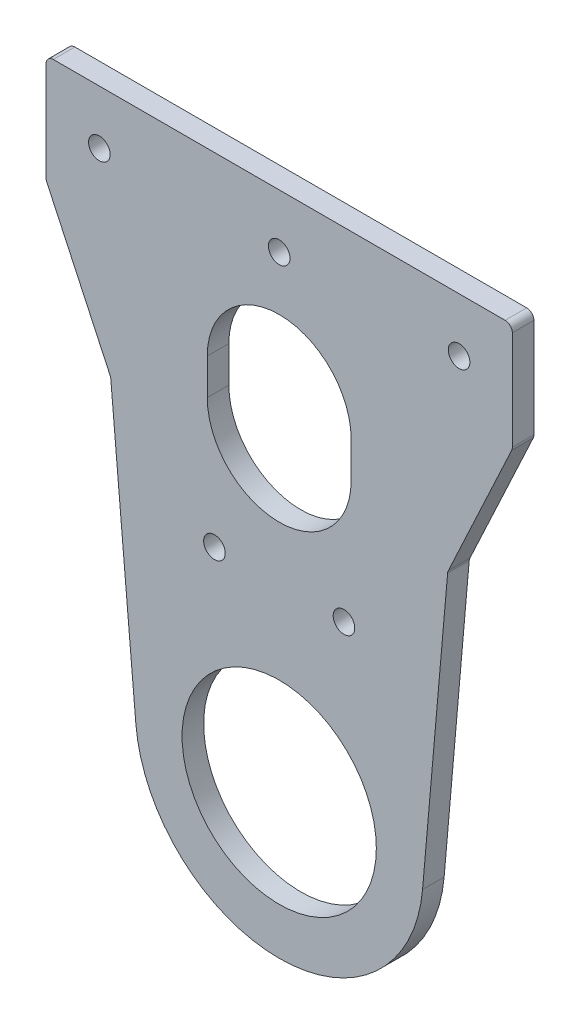
ISO-10303-21;
HEADER;
FILE_DESCRIPTION(('STEP AP214'),'2;1');
FILE_NAME('part.step','',(''),(''),'','','');
FILE_SCHEMA(('AUTOMOTIVE_DESIGN { 1 0 10303 214 1 1 1 1 }'));
ENDSEC;
DATA;
#1=APPLICATION_CONTEXT('core data for automotive mechanical design processes');
#2=APPLICATION_PROTOCOL_DEFINITION('international standard','automotive_design',2000,#1);
#3=PRODUCT_CONTEXT('',#1,'mechanical');
#4=PRODUCT('Part','Part','',(#3));
#5=PRODUCT_RELATED_PRODUCT_CATEGORY('part','',(#4));
#6=PRODUCT_DEFINITION_FORMATION('','',#4);
#7=PRODUCT_DEFINITION_CONTEXT('part definition',#1,'design');
#8=PRODUCT_DEFINITION('design','',#6,#7);
#9=PRODUCT_DEFINITION_SHAPE('','',#8);
#10=(LENGTH_UNIT() NAMED_UNIT(*) SI_UNIT(.MILLI.,.METRE.));
#11=(NAMED_UNIT(*) PLANE_ANGLE_UNIT() SI_UNIT($,.RADIAN.));
#12=(NAMED_UNIT(*) SI_UNIT($,.STERADIAN.) SOLID_ANGLE_UNIT());
#13=UNCERTAINTY_MEASURE_WITH_UNIT(LENGTH_MEASURE(1.E-05),#10,'distance_accuracy_value','');
#14=(GEOMETRIC_REPRESENTATION_CONTEXT(3) GLOBAL_UNCERTAINTY_ASSIGNED_CONTEXT((#13)) GLOBAL_UNIT_ASSIGNED_CONTEXT((#10,
#11,#12)) REPRESENTATION_CONTEXT('',''));
#15=CARTESIAN_POINT('',(0.,0.,0.));
#16=DIRECTION('',(0.,0.,1.));
#17=DIRECTION('',(1.,0.,0.));
#18=AXIS2_PLACEMENT_3D('',#15,#16,#17);
#19=CARTESIAN_POINT('',(0.,0.,3.));
#20=DIRECTION('',(0.,0.,1.));
#21=DIRECTION('',(1.,0.,0.));
#22=AXIS2_PLACEMENT_3D('',#19,#20,#21);
#23=PLANE('',#22);
#24=CARTESIAN_POINT('',(-9.,25.,3.));
#25=DIRECTION('',(0.,0.,1.));
#26=DIRECTION('',(1.,0.,0.));
#27=AXIS2_PLACEMENT_3D('',#24,#25,#26);
#28=CIRCLE('',#27,1.5);
#29=CARTESIAN_POINT('',(-7.5,25.,3.));
#30=VERTEX_POINT('',#29);
#31=EDGE_CURVE('E197',#30,#30,#28,.T.);
#32=ORIENTED_EDGE('',*,*,#31,.F.);
#33=EDGE_LOOP('',(#32));
#34=FACE_BOUND('',#33,.T.);
#35=CARTESIAN_POINT('',(-25.,65.,3.));
#36=DIRECTION('',(0.,0.,1.));
#37=DIRECTION('',(1.,0.,0.));
#38=AXIS2_PLACEMENT_3D('',#35,#36,#37);
#39=CIRCLE('',#38,1.5);
#40=CARTESIAN_POINT('',(-23.5,65.,3.));
#41=VERTEX_POINT('',#40);
#42=EDGE_CURVE('E214',#41,#41,#39,.T.);
#43=ORIENTED_EDGE('',*,*,#42,.F.);
#44=EDGE_LOOP('',(#43));
#45=FACE_BOUND('',#44,.T.);
#46=CARTESIAN_POINT('',(0.,0.,3.));
#47=DIRECTION('',(0.,0.,1.));
#48=DIRECTION('',(1.,0.,0.));
#49=AXIS2_PLACEMENT_3D('',#46,#47,#48);
#50=CIRCLE('',#49,13.5);
#51=CARTESIAN_POINT('',(13.5,0.,3.));
#52=VERTEX_POINT('',#51);
#53=EDGE_CURVE('E226',#52,#52,#50,.T.);
#54=ORIENTED_EDGE('',*,*,#53,.F.);
#55=EDGE_LOOP('',(#54));
#56=FACE_BOUND('',#55,.T.);
#57=DIRECTION('',(0.,-1.,0.));
#58=VECTOR('',#57,1.);
#59=CARTESIAN_POINT('',(-32.4,72.5,3.));
#60=LINE('',#59,#58);
#61=CARTESIAN_POINT('',(-32.4,71.5,3.));
#62=VERTEX_POINT('',#61);
#63=CARTESIAN_POINT('',(-32.4,57.7216946626429,3.));
#64=VERTEX_POINT('',#63);
#65=EDGE_CURVE('E242',#62,#64,#60,.T.);
#66=ORIENTED_EDGE('',*,*,#65,.T.);
#67=CARTESIAN_POINT('',(-31.4,57.7216946626429,3.));
#68=DIRECTION('',(0.,0.,1.));
#69=DIRECTION('',(1.,0.,0.));
#70=AXIS2_PLACEMENT_3D('',#67,#68,#69);
#71=CIRCLE('',#70,1.);
#72=CARTESIAN_POINT('',(-32.3063077870366,57.2990764009022,3.));
#73=VERTEX_POINT('',#72);
#74=EDGE_CURVE('E302',#64,#73,#71,.T.);
#75=ORIENTED_EDGE('',*,*,#74,.T.);
#76=DIRECTION('',(0.4226182617407,-0.90630778703665,0.));
#77=VECTOR('',#76,1.);
#78=CARTESIAN_POINT('',(-32.4,57.5,3.));
#79=LINE('',#78,#77);
#80=CARTESIAN_POINT('',(-23.4971863560778,38.407854528602,3.));
#81=VERTEX_POINT('',#80);
#82=EDGE_CURVE('E245',#73,#81,#79,.T.);
#83=ORIENTED_EDGE('',*,*,#82,.T.);
#84=CARTESIAN_POINT('',(-24.4034941431145,37.9852362668613,3.));
#85=DIRECTION('',(0.,0.,1.));
#86=DIRECTION('',(1.,0.,0.));
#87=AXIS2_PLACEMENT_3D('',#84,#85,#86);
#88=CIRCLE('',#87,1.);
#89=CARTESIAN_POINT('',(-23.4072994450227,38.072392009609,3.));
#90=VERTEX_POINT('',#89);
#91=EDGE_CURVE('E11',#81,#90,#88,.F.);
#92=ORIENTED_EDGE('',*,*,#91,.T.);
#93=DIRECTION('',(0.0871557427476584,-0.996194698091745,0.));
#94=VECTOR('',#93,1.);
#95=CARTESIAN_POINT('',(-23.4226673539928,38.2480480129213,3.));
#96=LINE('',#95,#94);
#97=CARTESIAN_POINT('',(-19.9238939618349,-1.74311485495317,3.));
#98=VERTEX_POINT('',#97);
#99=EDGE_CURVE('E247',#90,#98,#96,.T.);
#100=ORIENTED_EDGE('',*,*,#99,.T.);
#101=CARTESIAN_POINT('',(0.,0.,3.));
#102=DIRECTION('',(0.,0.,1.));
#103=DIRECTION('',(1.,0.,0.));
#104=AXIS2_PLACEMENT_3D('',#101,#102,#103);
#105=CIRCLE('',#104,20.);
#106=CARTESIAN_POINT('',(19.9238939618349,-1.74311485495318,3.));
#107=VERTEX_POINT('',#106);
#108=EDGE_CURVE('E249',#98,#107,#105,.T.);
#109=ORIENTED_EDGE('',*,*,#108,.T.);
#110=DIRECTION('',(0.0871557427476584,0.996194698091745,0.));
#111=VECTOR('',#110,1.);
#112=CARTESIAN_POINT('',(23.4226673539928,38.2480480129213,3.));
#113=LINE('',#112,#111);
#114=CARTESIAN_POINT('',(23.4072994450227,38.072392009609,3.));
#115=VERTEX_POINT('',#114);
#116=EDGE_CURVE('E251',#107,#115,#113,.T.);
#117=ORIENTED_EDGE('',*,*,#116,.T.);
#118=CARTESIAN_POINT('',(24.4034941431145,37.9852362668613,3.));
#119=DIRECTION('',(0.,0.,1.));
#120=DIRECTION('',(1.,0.,0.));
#121=AXIS2_PLACEMENT_3D('',#118,#119,#120);
#122=CIRCLE('',#121,1.);
#123=CARTESIAN_POINT('',(23.4971863560778,38.407854528602,3.));
#124=VERTEX_POINT('',#123);
#125=EDGE_CURVE('E325',#115,#124,#122,.F.);
#126=ORIENTED_EDGE('',*,*,#125,.T.);
#127=DIRECTION('',(0.4226182617407,0.90630778703665,0.));
#128=VECTOR('',#127,1.);
#129=CARTESIAN_POINT('',(32.4,57.5,3.));
#130=LINE('',#129,#128);
#131=CARTESIAN_POINT('',(32.3063077870366,57.2990764009022,3.));
#132=VERTEX_POINT('',#131);
#133=EDGE_CURVE('E232',#124,#132,#130,.T.);
#134=ORIENTED_EDGE('',*,*,#133,.T.);
#135=CARTESIAN_POINT('',(31.4,57.7216946626429,3.));
#136=DIRECTION('',(0.,0.,1.));
#137=DIRECTION('',(1.,0.,0.));
#138=AXIS2_PLACEMENT_3D('',#135,#136,#137);
#139=CIRCLE('',#138,1.);
#140=CARTESIAN_POINT('',(32.4,57.7216946626429,3.));
#141=VERTEX_POINT('',#140);
#142=EDGE_CURVE('E300',#132,#141,#139,.T.);
#143=ORIENTED_EDGE('',*,*,#142,.T.);
#144=DIRECTION('',(0.,1.,0.));
#145=VECTOR('',#144,1.);
#146=CARTESIAN_POINT('',(32.4,72.5,3.));
#147=LINE('',#146,#145);
#148=CARTESIAN_POINT('',(32.4,71.5,3.));
#149=VERTEX_POINT('',#148);
#150=EDGE_CURVE('E235',#141,#149,#147,.T.);
#151=ORIENTED_EDGE('',*,*,#150,.T.);
#152=CARTESIAN_POINT('',(31.4,71.5,3.));
#153=DIRECTION('',(0.,0.,1.));
#154=DIRECTION('',(1.,0.,0.));
#155=AXIS2_PLACEMENT_3D('',#152,#153,#154);
#156=CIRCLE('',#155,1.);
#157=CARTESIAN_POINT('',(31.4,72.5,3.));
#158=VERTEX_POINT('',#157);
#159=EDGE_CURVE('E298',#149,#158,#156,.T.);
#160=ORIENTED_EDGE('',*,*,#159,.T.);
#161=DIRECTION('',(-1.,0.,0.));
#162=VECTOR('',#161,1.);
#163=CARTESIAN_POINT('',(-32.4,72.5,3.));
#164=LINE('',#163,#162);
#165=CARTESIAN_POINT('',(-31.4,72.5,3.));
#166=VERTEX_POINT('',#165);
#167=EDGE_CURVE('E239',#158,#166,#164,.T.);
#168=ORIENTED_EDGE('',*,*,#167,.T.);
#169=CARTESIAN_POINT('',(-31.4,71.5,3.));
#170=DIRECTION('',(0.,0.,1.));
#171=DIRECTION('',(1.,0.,0.));
#172=AXIS2_PLACEMENT_3D('',#169,#170,#171);
#173=CIRCLE('',#172,1.);
#174=EDGE_CURVE('E296',#166,#62,#173,.T.);
#175=ORIENTED_EDGE('',*,*,#174,.T.);
#176=EDGE_LOOP('',(#66,#75,#83,#92,#100,#109,#117,#126,#134,#143,#151,#160,#168,#175));
#177=FACE_BOUND('',#176,.T.);
#178=CARTESIAN_POINT('',(25.,65.,3.));
#179=DIRECTION('',(0.,0.,1.));
#180=DIRECTION('',(1.,0.,0.));
#181=AXIS2_PLACEMENT_3D('',#178,#179,#180);
#182=CIRCLE('',#181,1.5);
#183=CARTESIAN_POINT('',(26.5,65.,3.));
#184=VERTEX_POINT('',#183);
#185=EDGE_CURVE('E220',#184,#184,#182,.T.);
#186=ORIENTED_EDGE('',*,*,#185,.F.);
#187=EDGE_LOOP('',(#186));
#188=FACE_BOUND('',#187,.T.);
#189=CARTESIAN_POINT('',(0.,65.,3.));
#190=DIRECTION('',(0.,0.,1.));
#191=DIRECTION('',(1.,0.,0.));
#192=AXIS2_PLACEMENT_3D('',#189,#190,#191);
#193=CIRCLE('',#192,1.5);
#194=CARTESIAN_POINT('',(1.5,65.,3.));
#195=VERTEX_POINT('',#194);
#196=EDGE_CURVE('E208',#195,#195,#193,.T.);
#197=ORIENTED_EDGE('',*,*,#196,.F.);
#198=EDGE_LOOP('',(#197));
#199=FACE_BOUND('',#198,.T.);
#200=DIRECTION('',(0.,-1.,0.));
#201=VECTOR('',#200,1.);
#202=CARTESIAN_POINT('',(-10.,47.5,3.));
#203=LINE('',#202,#201);
#204=CARTESIAN_POINT('',(-10.,47.5,3.));
#205=VERTEX_POINT('',#204);
#206=CARTESIAN_POINT('',(-10.,42.5,3.));
#207=VERTEX_POINT('',#206);
#208=EDGE_CURVE('E174',#205,#207,#203,.T.);
#209=ORIENTED_EDGE('',*,*,#208,.F.);
#210=CARTESIAN_POINT('',(0.,47.5,3.));
#211=DIRECTION('',(0.,0.,1.));
#212=DIRECTION('',(1.,0.,0.));
#213=AXIS2_PLACEMENT_3D('',#210,#211,#212);
#214=CIRCLE('',#213,10.);
#215=CARTESIAN_POINT('',(10.,47.5,3.));
#216=VERTEX_POINT('',#215);
#217=EDGE_CURVE('E164',#216,#205,#214,.T.);
#218=ORIENTED_EDGE('',*,*,#217,.F.);
#219=DIRECTION('',(0.,1.,0.));
#220=VECTOR('',#219,1.);
#221=CARTESIAN_POINT('',(10.,47.5,3.));
#222=LINE('',#221,#220);
#223=CARTESIAN_POINT('',(10.,42.5,3.));
#224=VERTEX_POINT('',#223);
#225=EDGE_CURVE('E190',#224,#216,#222,.T.);
#226=ORIENTED_EDGE('',*,*,#225,.F.);
#227=CARTESIAN_POINT('',(0.,42.5,3.));
#228=DIRECTION('',(0.,0.,1.));
#229=DIRECTION('',(1.,0.,0.));
#230=AXIS2_PLACEMENT_3D('',#227,#228,#229);
#231=CIRCLE('',#230,10.);
#232=EDGE_CURVE('E188',#207,#224,#231,.T.);
#233=ORIENTED_EDGE('',*,*,#232,.F.);
#234=EDGE_LOOP('',(#209,#218,#226,#233));
#235=FACE_BOUND('',#234,.T.);
#236=CARTESIAN_POINT('',(9.,25.,3.));
#237=DIRECTION('',(0.,0.,1.));
#238=DIRECTION('',(1.,0.,0.));
#239=AXIS2_PLACEMENT_3D('',#236,#237,#238);
#240=CIRCLE('',#239,1.5);
#241=CARTESIAN_POINT('',(10.5,25.,3.));
#242=VERTEX_POINT('',#241);
#243=EDGE_CURVE('E413',#242,#242,#240,.T.);
#244=ORIENTED_EDGE('',*,*,#243,.F.);
#245=EDGE_LOOP('',(#244));
#246=FACE_BOUND('',#245,.T.);
#247=ADVANCED_FACE('F37',(#34,#45,#56,#177,#188,#199,#235,#246),#23,.T.);
#248=CARTESIAN_POINT('',(0.,0.,0.));
#249=DIRECTION('',(0.,0.,1.));
#250=DIRECTION('',(1.,0.,0.));
#251=AXIS2_PLACEMENT_3D('',#248,#249,#250);
#252=PLANE('',#251);
#253=CARTESIAN_POINT('',(0.,65.,0.));
#254=DIRECTION('',(0.,0.,1.));
#255=DIRECTION('',(1.,0.,0.));
#256=AXIS2_PLACEMENT_3D('',#253,#254,#255);
#257=CIRCLE('',#256,1.5);
#258=CARTESIAN_POINT('',(1.5,65.,0.));
#259=VERTEX_POINT('',#258);
#260=EDGE_CURVE('E182',#259,#259,#257,.T.);
#261=ORIENTED_EDGE('',*,*,#260,.T.);
#262=EDGE_LOOP('',(#261));
#263=FACE_BOUND('',#262,.T.);
#264=CARTESIAN_POINT('',(-25.,65.,0.));
#265=DIRECTION('',(0.,0.,1.));
#266=DIRECTION('',(1.,0.,0.));
#267=AXIS2_PLACEMENT_3D('',#264,#265,#266);
#268=CIRCLE('',#267,1.5);
#269=CARTESIAN_POINT('',(-23.5,65.,0.));
#270=VERTEX_POINT('',#269);
#271=EDGE_CURVE('E211',#270,#270,#268,.T.);
#272=ORIENTED_EDGE('',*,*,#271,.T.);
#273=EDGE_LOOP('',(#272));
#274=FACE_BOUND('',#273,.T.);
#275=CARTESIAN_POINT('',(25.,65.,0.));
#276=DIRECTION('',(0.,0.,1.));
#277=DIRECTION('',(1.,0.,0.));
#278=AXIS2_PLACEMENT_3D('',#275,#276,#277);
#279=CIRCLE('',#278,1.5);
#280=CARTESIAN_POINT('',(26.5,65.,0.));
#281=VERTEX_POINT('',#280);
#282=EDGE_CURVE('E217',#281,#281,#279,.T.);
#283=ORIENTED_EDGE('',*,*,#282,.T.);
#284=EDGE_LOOP('',(#283));
#285=FACE_BOUND('',#284,.T.);
#286=CARTESIAN_POINT('',(0.,0.,0.));
#287=DIRECTION('',(0.,0.,1.));
#288=DIRECTION('',(1.,0.,0.));
#289=AXIS2_PLACEMENT_3D('',#286,#287,#288);
#290=CIRCLE('',#289,13.5);
#291=CARTESIAN_POINT('',(13.5,0.,0.));
#292=VERTEX_POINT('',#291);
#293=EDGE_CURVE('E223',#292,#292,#290,.T.);
#294=ORIENTED_EDGE('',*,*,#293,.T.);
#295=EDGE_LOOP('',(#294));
#296=FACE_BOUND('',#295,.T.);
#297=DIRECTION('',(0.4226182617407,-0.90630778703665,0.));
#298=VECTOR('',#297,1.);
#299=CARTESIAN_POINT('',(-32.4,57.5,0.));
#300=LINE('',#299,#298);
#301=CARTESIAN_POINT('',(-32.3063077870366,57.2990764009022,0.));
#302=VERTEX_POINT('',#301);
#303=CARTESIAN_POINT('',(-23.4971863560778,38.407854528602,0.));
#304=VERTEX_POINT('',#303);
#305=EDGE_CURVE('E265',#302,#304,#300,.T.);
#306=ORIENTED_EDGE('',*,*,#305,.F.);
#307=CARTESIAN_POINT('',(-31.4,57.7216946626429,0.));
#308=DIRECTION('',(0.,0.,1.));
#309=DIRECTION('',(1.,0.,0.));
#310=AXIS2_PLACEMENT_3D('',#307,#308,#309);
#311=CIRCLE('',#310,1.);
#312=CARTESIAN_POINT('',(-32.4,57.7216946626429,0.));
#313=VERTEX_POINT('',#312);
#314=EDGE_CURVE('E289',#302,#313,#311,.F.);
#315=ORIENTED_EDGE('',*,*,#314,.T.);
#316=DIRECTION('',(0.,-1.,0.));
#317=VECTOR('',#316,1.);
#318=CARTESIAN_POINT('',(-32.4,72.5,0.));
#319=LINE('',#318,#317);
#320=CARTESIAN_POINT('',(-32.4,71.5,0.));
#321=VERTEX_POINT('',#320);
#322=EDGE_CURVE('E262',#321,#313,#319,.T.);
#323=ORIENTED_EDGE('',*,*,#322,.F.);
#324=CARTESIAN_POINT('',(-31.4,71.5,0.));
#325=DIRECTION('',(0.,0.,1.));
#326=DIRECTION('',(1.,0.,0.));
#327=AXIS2_PLACEMENT_3D('',#324,#325,#326);
#328=CIRCLE('',#327,1.);
#329=CARTESIAN_POINT('',(-31.4,72.5,0.));
#330=VERTEX_POINT('',#329);
#331=EDGE_CURVE('E283',#321,#330,#328,.F.);
#332=ORIENTED_EDGE('',*,*,#331,.T.);
#333=DIRECTION('',(-1.,0.,0.));
#334=VECTOR('',#333,1.);
#335=CARTESIAN_POINT('',(-32.4,72.5,0.));
#336=LINE('',#335,#334);
#337=CARTESIAN_POINT('',(31.4,72.5,0.));
#338=VERTEX_POINT('',#337);
#339=EDGE_CURVE('E259',#338,#330,#336,.T.);
#340=ORIENTED_EDGE('',*,*,#339,.F.);
#341=CARTESIAN_POINT('',(31.4,71.5,0.));
#342=DIRECTION('',(0.,0.,1.));
#343=DIRECTION('',(1.,0.,0.));
#344=AXIS2_PLACEMENT_3D('',#341,#342,#343);
#345=CIRCLE('',#344,1.);
#346=CARTESIAN_POINT('',(32.4,71.5,0.));
#347=VERTEX_POINT('',#346);
#348=EDGE_CURVE('E285',#338,#347,#345,.F.);
#349=ORIENTED_EDGE('',*,*,#348,.T.);
#350=DIRECTION('',(0.,1.,0.));
#351=VECTOR('',#350,1.);
#352=CARTESIAN_POINT('',(32.4,72.5,0.));
#353=LINE('',#352,#351);
#354=CARTESIAN_POINT('',(32.4,57.7216946626429,0.));
#355=VERTEX_POINT('',#354);
#356=EDGE_CURVE('E256',#355,#347,#353,.T.);
#357=ORIENTED_EDGE('',*,*,#356,.F.);
#358=CARTESIAN_POINT('',(31.4,57.7216946626429,0.));
#359=DIRECTION('',(0.,0.,1.));
#360=DIRECTION('',(1.,0.,0.));
#361=AXIS2_PLACEMENT_3D('',#358,#359,#360);
#362=CIRCLE('',#361,1.);
#363=CARTESIAN_POINT('',(32.3063077870366,57.2990764009022,0.));
#364=VERTEX_POINT('',#363);
#365=EDGE_CURVE('E287',#355,#364,#362,.F.);
#366=ORIENTED_EDGE('',*,*,#365,.T.);
#367=DIRECTION('',(0.4226182617407,0.90630778703665,0.));
#368=VECTOR('',#367,1.);
#369=CARTESIAN_POINT('',(32.4,57.5,0.));
#370=LINE('',#369,#368);
#371=CARTESIAN_POINT('',(23.4971863560778,38.407854528602,0.));
#372=VERTEX_POINT('',#371);
#373=EDGE_CURVE('E229',#372,#364,#370,.T.);
#374=ORIENTED_EDGE('',*,*,#373,.F.);
#375=CARTESIAN_POINT('',(24.4034941431145,37.9852362668613,0.));
#376=DIRECTION('',(0.,0.,1.));
#377=DIRECTION('',(1.,0.,0.));
#378=AXIS2_PLACEMENT_3D('',#375,#376,#377);
#379=CIRCLE('',#378,1.);
#380=CARTESIAN_POINT('',(23.4072994450227,38.072392009609,0.));
#381=VERTEX_POINT('',#380);
#382=EDGE_CURVE('E323',#372,#381,#379,.T.);
#383=ORIENTED_EDGE('',*,*,#382,.T.);
#384=DIRECTION('',(0.0871557427476584,0.996194698091745,0.));
#385=VECTOR('',#384,1.);
#386=CARTESIAN_POINT('',(23.4226673539928,38.2480480129213,0.));
#387=LINE('',#386,#385);
#388=CARTESIAN_POINT('',(19.9238939618349,-1.74311485495318,0.));
#389=VERTEX_POINT('',#388);
#390=EDGE_CURVE('E236',#389,#381,#387,.T.);
#391=ORIENTED_EDGE('',*,*,#390,.F.);
#392=CARTESIAN_POINT('',(0.,0.,0.));
#393=DIRECTION('',(0.,0.,1.));
#394=DIRECTION('',(1.,0.,0.));
#395=AXIS2_PLACEMENT_3D('',#392,#393,#394);
#396=CIRCLE('',#395,20.);
#397=CARTESIAN_POINT('',(-19.9238939618349,-1.74311485495317,0.));
#398=VERTEX_POINT('',#397);
#399=EDGE_CURVE('E270',#398,#389,#396,.T.);
#400=ORIENTED_EDGE('',*,*,#399,.F.);
#401=DIRECTION('',(0.0871557427476584,-0.996194698091745,0.));
#402=VECTOR('',#401,1.);
#403=CARTESIAN_POINT('',(-23.4226673539928,38.2480480129213,0.));
#404=LINE('',#403,#402);
#405=CARTESIAN_POINT('',(-23.4072994450227,38.072392009609,0.));
#406=VERTEX_POINT('',#405);
#407=EDGE_CURVE('E268',#406,#398,#404,.T.);
#408=ORIENTED_EDGE('',*,*,#407,.F.);
#409=CARTESIAN_POINT('',(-24.4034941431145,37.9852362668613,0.));
#410=DIRECTION('',(0.,0.,1.));
#411=DIRECTION('',(1.,0.,0.));
#412=AXIS2_PLACEMENT_3D('',#409,#410,#411);
#413=CIRCLE('',#412,1.);
#414=EDGE_CURVE('E45',#406,#304,#413,.T.);
#415=ORIENTED_EDGE('',*,*,#414,.T.);
#416=EDGE_LOOP('',(#306,#315,#323,#332,#340,#349,#357,#366,#374,#383,#391,#400,#408,#415));
#417=FACE_BOUND('',#416,.T.);
#418=CARTESIAN_POINT('',(0.,47.5,0.));
#419=DIRECTION('',(0.,0.,1.));
#420=DIRECTION('',(1.,0.,0.));
#421=AXIS2_PLACEMENT_3D('',#418,#419,#420);
#422=CIRCLE('',#421,10.);
#423=CARTESIAN_POINT('',(10.,47.5,0.));
#424=VERTEX_POINT('',#423);
#425=CARTESIAN_POINT('',(-10.,47.5,0.));
#426=VERTEX_POINT('',#425);
#427=EDGE_CURVE('E195',#424,#426,#422,.T.);
#428=ORIENTED_EDGE('',*,*,#427,.T.);
#429=DIRECTION('',(0.,-1.,0.));
#430=VECTOR('',#429,1.);
#431=CARTESIAN_POINT('',(-10.,47.5,0.));
#432=LINE('',#431,#430);
#433=CARTESIAN_POINT('',(-10.,42.5,0.));
#434=VERTEX_POINT('',#433);
#435=EDGE_CURVE('E181',#426,#434,#432,.T.);
#436=ORIENTED_EDGE('',*,*,#435,.T.);
#437=CARTESIAN_POINT('',(0.,42.5,0.));
#438=DIRECTION('',(0.,0.,1.));
#439=DIRECTION('',(1.,0.,0.));
#440=AXIS2_PLACEMENT_3D('',#437,#438,#439);
#441=CIRCLE('',#440,10.);
#442=CARTESIAN_POINT('',(10.,42.5,0.));
#443=VERTEX_POINT('',#442);
#444=EDGE_CURVE('E199',#434,#443,#441,.T.);
#445=ORIENTED_EDGE('',*,*,#444,.T.);
#446=DIRECTION('',(0.,1.,0.));
#447=VECTOR('',#446,1.);
#448=CARTESIAN_POINT('',(10.,47.5,0.));
#449=LINE('',#448,#447);
#450=EDGE_CURVE('E175',#443,#424,#449,.T.);
#451=ORIENTED_EDGE('',*,*,#450,.T.);
#452=EDGE_LOOP('',(#428,#436,#445,#451));
#453=FACE_BOUND('',#452,.T.);
#454=CARTESIAN_POINT('',(-9.,25.,0.));
#455=DIRECTION('',(0.,0.,1.));
#456=DIRECTION('',(1.,0.,0.));
#457=AXIS2_PLACEMENT_3D('',#454,#455,#456);
#458=CIRCLE('',#457,1.5);
#459=CARTESIAN_POINT('',(-7.5,25.,0.));
#460=VERTEX_POINT('',#459);
#461=EDGE_CURVE('E419',#460,#460,#458,.T.);
#462=ORIENTED_EDGE('',*,*,#461,.T.);
#463=EDGE_LOOP('',(#462));
#464=FACE_BOUND('',#463,.T.);
#465=CARTESIAN_POINT('',(9.,25.,0.));
#466=DIRECTION('',(0.,0.,1.));
#467=DIRECTION('',(1.,0.,0.));
#468=AXIS2_PLACEMENT_3D('',#465,#466,#467);
#469=CIRCLE('',#468,1.5);
#470=CARTESIAN_POINT('',(10.5,25.,0.));
#471=VERTEX_POINT('',#470);
#472=EDGE_CURVE('E416',#471,#471,#469,.T.);
#473=ORIENTED_EDGE('',*,*,#472,.T.);
#474=EDGE_LOOP('',(#473));
#475=FACE_BOUND('',#474,.T.);
#476=ADVANCED_FACE('F329',(#263,#274,#285,#296,#417,#453,#464,#475),#252,.F.);
#477=CARTESIAN_POINT('',(32.4,57.5,3.));
#478=DIRECTION('',(-0.906307787036649,0.4226182617407,0.));
#479=DIRECTION('',(-0.4226182617407,-0.90630778703665,0.));
#480=AXIS2_PLACEMENT_3D('',#477,#478,#479);
#481=PLANE('',#480);
#482=ORIENTED_EDGE('',*,*,#373,.T.);
#483=DIRECTION('',(0.,0.,-1.));
#484=VECTOR('',#483,1.);
#485=CARTESIAN_POINT('',(32.3063077870366,57.2990764009022,3.));
#486=LINE('',#485,#484);
#487=EDGE_CURVE('E312',#364,#132,#486,.F.);
#488=ORIENTED_EDGE('',*,*,#487,.T.);
#489=ORIENTED_EDGE('',*,*,#133,.F.);
#490=DIRECTION('',(0.,0.,-1.));
#491=VECTOR('',#490,1.);
#492=CARTESIAN_POINT('',(23.4971863560778,38.407854528602,0.));
#493=LINE('',#492,#491);
#494=EDGE_CURVE('E309',#124,#372,#493,.T.);
#495=ORIENTED_EDGE('',*,*,#494,.T.);
#496=EDGE_LOOP('',(#482,#488,#489,#495));
#497=FACE_BOUND('',#496,.T.);
#498=ADVANCED_FACE('F368',(#497),#481,.F.);
#499=CARTESIAN_POINT('',(32.4,72.5,3.));
#500=DIRECTION('',(-1.,0.,0.));
#501=DIRECTION('',(0.,0.,1.));
#502=AXIS2_PLACEMENT_3D('',#499,#500,#501);
#503=PLANE('',#502);
#504=ORIENTED_EDGE('',*,*,#150,.F.);
#505=DIRECTION('',(0.,0.,-1.));
#506=VECTOR('',#505,1.);
#507=CARTESIAN_POINT('',(32.4,57.7216946626429,3.));
#508=LINE('',#507,#506);
#509=EDGE_CURVE('E306',#141,#355,#508,.T.);
#510=ORIENTED_EDGE('',*,*,#509,.T.);
#511=ORIENTED_EDGE('',*,*,#356,.T.);
#512=DIRECTION('',(0.,0.,-1.));
#513=VECTOR('',#512,1.);
#514=CARTESIAN_POINT('',(32.4,71.5,3.));
#515=LINE('',#514,#513);
#516=EDGE_CURVE('E304',#347,#149,#515,.F.);
#517=ORIENTED_EDGE('',*,*,#516,.T.);
#518=EDGE_LOOP('',(#504,#510,#511,#517));
#519=FACE_BOUND('',#518,.T.);
#520=ADVANCED_FACE('F467',(#519),#503,.F.);
#521=CARTESIAN_POINT('',(-32.4,72.5,3.));
#522=DIRECTION('',(0.,-1.,0.));
#523=DIRECTION('',(0.,0.,-1.));
#524=AXIS2_PLACEMENT_3D('',#521,#522,#523);
#525=PLANE('',#524);
#526=ORIENTED_EDGE('',*,*,#167,.F.);
#527=DIRECTION('',(0.,0.,-1.));
#528=VECTOR('',#527,1.);
#529=CARTESIAN_POINT('',(31.4,72.5,3.));
#530=LINE('',#529,#528);
#531=EDGE_CURVE('E316',#158,#338,#530,.T.);
#532=ORIENTED_EDGE('',*,*,#531,.T.);
#533=ORIENTED_EDGE('',*,*,#339,.T.);
#534=DIRECTION('',(0.,0.,-1.));
#535=VECTOR('',#534,1.);
#536=CARTESIAN_POINT('',(-31.4,72.5,3.));
#537=LINE('',#536,#535);
#538=EDGE_CURVE('E314',#330,#166,#537,.F.);
#539=ORIENTED_EDGE('',*,*,#538,.T.);
#540=EDGE_LOOP('',(#526,#532,#533,#539));
#541=FACE_BOUND('',#540,.T.);
#542=ADVANCED_FACE('F460',(#541),#525,.F.);
#543=CARTESIAN_POINT('',(-32.4,72.5,3.));
#544=DIRECTION('',(1.,0.,0.));
#545=DIRECTION('',(0.,0.,-1.));
#546=AXIS2_PLACEMENT_3D('',#543,#544,#545);
#547=PLANE('',#546);
#548=ORIENTED_EDGE('',*,*,#322,.T.);
#549=DIRECTION('',(0.,0.,-1.));
#550=VECTOR('',#549,1.);
#551=CARTESIAN_POINT('',(-32.4,57.7216946626429,3.));
#552=LINE('',#551,#550);
#553=EDGE_CURVE('E294',#313,#64,#552,.F.);
#554=ORIENTED_EDGE('',*,*,#553,.T.);
#555=ORIENTED_EDGE('',*,*,#65,.F.);
#556=DIRECTION('',(0.,0.,-1.));
#557=VECTOR('',#556,1.);
#558=CARTESIAN_POINT('',(-32.4,71.5,3.));
#559=LINE('',#558,#557);
#560=EDGE_CURVE('E291',#62,#321,#559,.T.);
#561=ORIENTED_EDGE('',*,*,#560,.T.);
#562=EDGE_LOOP('',(#548,#554,#555,#561));
#563=FACE_BOUND('',#562,.T.);
#564=ADVANCED_FACE('F455',(#563),#547,.F.);
#565=CARTESIAN_POINT('',(-32.4,57.5,3.));
#566=DIRECTION('',(0.906307787036649,0.4226182617407,0.));
#567=DIRECTION('',(-0.4226182617407,0.90630778703665,0.));
#568=AXIS2_PLACEMENT_3D('',#565,#566,#567);
#569=PLANE('',#568);
#570=ORIENTED_EDGE('',*,*,#82,.F.);
#571=DIRECTION('',(0.,0.,-1.));
#572=VECTOR('',#571,1.);
#573=CARTESIAN_POINT('',(-32.3063077870366,57.2990764009022,3.));
#574=LINE('',#573,#572);
#575=EDGE_CURVE('E280',#73,#302,#574,.T.);
#576=ORIENTED_EDGE('',*,*,#575,.T.);
#577=ORIENTED_EDGE('',*,*,#305,.T.);
#578=DIRECTION('',(0.,0.,-1.));
#579=VECTOR('',#578,1.);
#580=CARTESIAN_POINT('',(-23.4971863560778,38.407854528602,3.));
#581=LINE('',#580,#579);
#582=EDGE_CURVE('E278',#304,#81,#581,.F.);
#583=ORIENTED_EDGE('',*,*,#582,.T.);
#584=EDGE_LOOP('',(#570,#576,#577,#583));
#585=FACE_BOUND('',#584,.T.);
#586=ADVANCED_FACE('F337',(#585),#569,.F.);
#587=CARTESIAN_POINT('',(-23.4226673539928,38.2480480129213,3.));
#588=DIRECTION('',(0.996194698091746,0.0871557427476584,0.));
#589=DIRECTION('',(-0.0871557427476584,0.996194698091746,0.));
#590=AXIS2_PLACEMENT_3D('',#587,#588,#589);
#591=PLANE('',#590);
#592=ORIENTED_EDGE('',*,*,#99,.F.);
#593=DIRECTION('',(0.,0.,-1.));
#594=VECTOR('',#593,1.);
#595=CARTESIAN_POINT('',(-23.4072994450227,38.072392009609,0.));
#596=LINE('',#595,#594);
#597=EDGE_CURVE('E320',#90,#406,#596,.T.);
#598=ORIENTED_EDGE('',*,*,#597,.T.);
#599=ORIENTED_EDGE('',*,*,#407,.T.);
#600=DIRECTION('',(0.,0.,-1.));
#601=VECTOR('',#600,1.);
#602=CARTESIAN_POINT('',(-19.9238939618349,-1.74311485495317,3.));
#603=LINE('',#602,#601);
#604=EDGE_CURVE('E275',#98,#398,#603,.T.);
#605=ORIENTED_EDGE('',*,*,#604,.F.);
#606=EDGE_LOOP('',(#592,#598,#599,#605));
#607=FACE_BOUND('',#606,.T.);
#608=ADVANCED_FACE('F340',(#607),#591,.F.);
#609=CARTESIAN_POINT('',(0.,0.,3.));
#610=DIRECTION('',(0.,0.,-1.));
#611=DIRECTION('',(-1.,0.,0.));
#612=AXIS2_PLACEMENT_3D('',#609,#610,#611);
#613=CYLINDRICAL_SURFACE('',#612,20.);
#614=ORIENTED_EDGE('',*,*,#399,.T.);
#615=DIRECTION('',(0.,0.,-1.));
#616=VECTOR('',#615,1.);
#617=CARTESIAN_POINT('',(19.9238939618349,-1.74311485495318,3.));
#618=LINE('',#617,#616);
#619=EDGE_CURVE('E253',#107,#389,#618,.T.);
#620=ORIENTED_EDGE('',*,*,#619,.F.);
#621=ORIENTED_EDGE('',*,*,#108,.F.);
#622=ORIENTED_EDGE('',*,*,#604,.T.);
#623=EDGE_LOOP('',(#614,#620,#621,#622));
#624=FACE_BOUND('',#623,.T.);
#625=ADVANCED_FACE('F347',(#624),#613,.T.);
#626=CARTESIAN_POINT('',(23.4226673539928,38.2480480129213,3.));
#627=DIRECTION('',(-0.996194698091746,0.0871557427476584,0.));
#628=DIRECTION('',(-0.0871557427476584,-0.996194698091746,0.));
#629=AXIS2_PLACEMENT_3D('',#626,#627,#628);
#630=PLANE('',#629);
#631=ORIENTED_EDGE('',*,*,#390,.T.);
#632=DIRECTION('',(0.,0.,-1.));
#633=VECTOR('',#632,1.);
#634=CARTESIAN_POINT('',(23.4072994450227,38.072392009609,3.));
#635=LINE('',#634,#633);
#636=EDGE_CURVE('E52',#381,#115,#635,.F.);
#637=ORIENTED_EDGE('',*,*,#636,.T.);
#638=ORIENTED_EDGE('',*,*,#116,.F.);
#639=ORIENTED_EDGE('',*,*,#619,.T.);
#640=EDGE_LOOP('',(#631,#637,#638,#639));
#641=FACE_BOUND('',#640,.T.);
#642=ADVANCED_FACE('F349',(#641),#630,.F.);
#643=CARTESIAN_POINT('',(0.,0.,3.));
#644=DIRECTION('',(0.,0.,-1.));
#645=DIRECTION('',(-1.,0.,0.));
#646=AXIS2_PLACEMENT_3D('',#643,#644,#645);
#647=CYLINDRICAL_SURFACE('',#646,13.5);
#648=ORIENTED_EDGE('',*,*,#53,.T.);
#649=EDGE_LOOP('',(#648));
#650=FACE_BOUND('',#649,.T.);
#651=ORIENTED_EDGE('',*,*,#293,.F.);
#652=EDGE_LOOP('',(#651));
#653=FACE_BOUND('',#652,.T.);
#654=ADVANCED_FACE('F351',(#650,#653),#647,.F.);
#655=CARTESIAN_POINT('',(25.,65.,3.));
#656=DIRECTION('',(0.,0.,-1.));
#657=DIRECTION('',(-1.,0.,0.));
#658=AXIS2_PLACEMENT_3D('',#655,#656,#657);
#659=CYLINDRICAL_SURFACE('',#658,1.5);
#660=ORIENTED_EDGE('',*,*,#185,.T.);
#661=EDGE_LOOP('',(#660));
#662=FACE_BOUND('',#661,.T.);
#663=ORIENTED_EDGE('',*,*,#282,.F.);
#664=EDGE_LOOP('',(#663));
#665=FACE_BOUND('',#664,.T.);
#666=ADVANCED_FACE('F357',(#662,#665),#659,.F.);
#667=CARTESIAN_POINT('',(-25.,65.,3.));
#668=DIRECTION('',(0.,0.,-1.));
#669=DIRECTION('',(-1.,0.,0.));
#670=AXIS2_PLACEMENT_3D('',#667,#668,#669);
#671=CYLINDRICAL_SURFACE('',#670,1.5);
#672=ORIENTED_EDGE('',*,*,#42,.T.);
#673=EDGE_LOOP('',(#672));
#674=FACE_BOUND('',#673,.T.);
#675=ORIENTED_EDGE('',*,*,#271,.F.);
#676=EDGE_LOOP('',(#675));
#677=FACE_BOUND('',#676,.T.);
#678=ADVANCED_FACE('F375',(#674,#677),#671,.F.);
#679=CARTESIAN_POINT('',(0.,65.,3.));
#680=DIRECTION('',(0.,0.,-1.));
#681=DIRECTION('',(-1.,0.,0.));
#682=AXIS2_PLACEMENT_3D('',#679,#680,#681);
#683=CYLINDRICAL_SURFACE('',#682,1.5);
#684=ORIENTED_EDGE('',*,*,#196,.T.);
#685=EDGE_LOOP('',(#684));
#686=FACE_BOUND('',#685,.T.);
#687=ORIENTED_EDGE('',*,*,#260,.F.);
#688=EDGE_LOOP('',(#687));
#689=FACE_BOUND('',#688,.T.);
#690=ADVANCED_FACE('F379',(#686,#689),#683,.F.);
#691=CARTESIAN_POINT('',(0.,47.5,3.));
#692=DIRECTION('',(0.,0.,-1.));
#693=DIRECTION('',(-1.,0.,0.));
#694=AXIS2_PLACEMENT_3D('',#691,#692,#693);
#695=CYLINDRICAL_SURFACE('',#694,10.);
#696=ORIENTED_EDGE('',*,*,#427,.F.);
#697=DIRECTION('',(0.,0.,-1.));
#698=VECTOR('',#697,1.);
#699=CARTESIAN_POINT('',(10.,47.5,3.));
#700=LINE('',#699,#698);
#701=EDGE_CURVE('E170',#216,#424,#700,.T.);
#702=ORIENTED_EDGE('',*,*,#701,.F.);
#703=ORIENTED_EDGE('',*,*,#217,.T.);
#704=DIRECTION('',(0.,0.,-1.));
#705=VECTOR('',#704,1.);
#706=CARTESIAN_POINT('',(-10.,47.5,3.));
#707=LINE('',#706,#705);
#708=EDGE_CURVE('E167',#205,#426,#707,.T.);
#709=ORIENTED_EDGE('',*,*,#708,.T.);
#710=EDGE_LOOP('',(#696,#702,#703,#709));
#711=FACE_BOUND('',#710,.T.);
#712=ADVANCED_FACE('F166',(#711),#695,.F.);
#713=CARTESIAN_POINT('',(-10.,47.5,3.));
#714=DIRECTION('',(1.,0.,0.));
#715=DIRECTION('',(0.,1.,0.));
#716=AXIS2_PLACEMENT_3D('',#713,#714,#715);
#717=PLANE('',#716);
#718=ORIENTED_EDGE('',*,*,#435,.F.);
#719=ORIENTED_EDGE('',*,*,#708,.F.);
#720=ORIENTED_EDGE('',*,*,#208,.T.);
#721=DIRECTION('',(0.,0.,-1.));
#722=VECTOR('',#721,1.);
#723=CARTESIAN_POINT('',(-10.,42.5,3.));
#724=LINE('',#723,#722);
#725=EDGE_CURVE('E183',#207,#434,#724,.T.);
#726=ORIENTED_EDGE('',*,*,#725,.T.);
#727=EDGE_LOOP('',(#718,#719,#720,#726));
#728=FACE_BOUND('',#727,.T.);
#729=ADVANCED_FACE('F178',(#728),#717,.T.);
#730=CARTESIAN_POINT('',(0.,42.5,3.));
#731=DIRECTION('',(0.,0.,-1.));
#732=DIRECTION('',(-1.,0.,0.));
#733=AXIS2_PLACEMENT_3D('',#730,#731,#732);
#734=CYLINDRICAL_SURFACE('',#733,10.);
#735=ORIENTED_EDGE('',*,*,#444,.F.);
#736=ORIENTED_EDGE('',*,*,#725,.F.);
#737=ORIENTED_EDGE('',*,*,#232,.T.);
#738=DIRECTION('',(0.,0.,-1.));
#739=VECTOR('',#738,1.);
#740=CARTESIAN_POINT('',(10.,42.5,3.));
#741=LINE('',#740,#739);
#742=EDGE_CURVE('E205',#224,#443,#741,.T.);
#743=ORIENTED_EDGE('',*,*,#742,.T.);
#744=EDGE_LOOP('',(#735,#736,#737,#743));
#745=FACE_BOUND('',#744,.T.);
#746=ADVANCED_FACE('F388',(#745),#734,.F.);
#747=CARTESIAN_POINT('',(10.,47.5,3.));
#748=DIRECTION('',(-1.,0.,0.));
#749=DIRECTION('',(0.,-1.,0.));
#750=AXIS2_PLACEMENT_3D('',#747,#748,#749);
#751=PLANE('',#750);
#752=ORIENTED_EDGE('',*,*,#450,.F.);
#753=ORIENTED_EDGE('',*,*,#742,.F.);
#754=ORIENTED_EDGE('',*,*,#225,.T.);
#755=ORIENTED_EDGE('',*,*,#701,.T.);
#756=EDGE_LOOP('',(#752,#753,#754,#755));
#757=FACE_BOUND('',#756,.T.);
#758=ADVANCED_FACE('F391',(#757),#751,.T.);
#759=CARTESIAN_POINT('',(-9.,25.,3.));
#760=DIRECTION('',(0.,0.,-1.));
#761=DIRECTION('',(-1.,0.,0.));
#762=AXIS2_PLACEMENT_3D('',#759,#760,#761);
#763=CYLINDRICAL_SURFACE('',#762,1.5);
#764=ORIENTED_EDGE('',*,*,#31,.T.);
#765=EDGE_LOOP('',(#764));
#766=FACE_BOUND('',#765,.T.);
#767=ORIENTED_EDGE('',*,*,#461,.F.);
#768=EDGE_LOOP('',(#767));
#769=FACE_BOUND('',#768,.T.);
#770=ADVANCED_FACE('F395',(#766,#769),#763,.F.);
#771=CARTESIAN_POINT('',(9.,25.,3.));
#772=DIRECTION('',(0.,0.,-1.));
#773=DIRECTION('',(-1.,0.,0.));
#774=AXIS2_PLACEMENT_3D('',#771,#772,#773);
#775=CYLINDRICAL_SURFACE('',#774,1.5);
#776=ORIENTED_EDGE('',*,*,#243,.T.);
#777=EDGE_LOOP('',(#776));
#778=FACE_BOUND('',#777,.T.);
#779=ORIENTED_EDGE('',*,*,#472,.F.);
#780=EDGE_LOOP('',(#779));
#781=FACE_BOUND('',#780,.T.);
#782=ADVANCED_FACE('F399',(#778,#781),#775,.F.);
#783=CARTESIAN_POINT('',(-31.4,57.7216946626429,3.));
#784=DIRECTION('',(0.,0.,-1.));
#785=DIRECTION('',(-1.,0.,0.));
#786=AXIS2_PLACEMENT_3D('',#783,#784,#785);
#787=CYLINDRICAL_SURFACE('',#786,1.);
#788=ORIENTED_EDGE('',*,*,#74,.F.);
#789=ORIENTED_EDGE('',*,*,#553,.F.);
#790=ORIENTED_EDGE('',*,*,#314,.F.);
#791=ORIENTED_EDGE('',*,*,#575,.F.);
#792=EDGE_LOOP('',(#788,#789,#790,#791));
#793=FACE_BOUND('',#792,.T.);
#794=ADVANCED_FACE('F402',(#793),#787,.T.);
#795=CARTESIAN_POINT('',(31.4,57.7216946626429,3.));
#796=DIRECTION('',(0.,0.,-1.));
#797=DIRECTION('',(-1.,0.,0.));
#798=AXIS2_PLACEMENT_3D('',#795,#796,#797);
#799=CYLINDRICAL_SURFACE('',#798,1.);
#800=ORIENTED_EDGE('',*,*,#142,.F.);
#801=ORIENTED_EDGE('',*,*,#487,.F.);
#802=ORIENTED_EDGE('',*,*,#365,.F.);
#803=ORIENTED_EDGE('',*,*,#509,.F.);
#804=EDGE_LOOP('',(#800,#801,#802,#803));
#805=FACE_BOUND('',#804,.T.);
#806=ADVANCED_FACE('F407',(#805),#799,.T.);
#807=CARTESIAN_POINT('',(31.4,71.5,3.));
#808=DIRECTION('',(0.,0.,-1.));
#809=DIRECTION('',(-1.,0.,0.));
#810=AXIS2_PLACEMENT_3D('',#807,#808,#809);
#811=CYLINDRICAL_SURFACE('',#810,1.);
#812=ORIENTED_EDGE('',*,*,#159,.F.);
#813=ORIENTED_EDGE('',*,*,#516,.F.);
#814=ORIENTED_EDGE('',*,*,#348,.F.);
#815=ORIENTED_EDGE('',*,*,#531,.F.);
#816=EDGE_LOOP('',(#812,#813,#814,#815));
#817=FACE_BOUND('',#816,.T.);
#818=ADVANCED_FACE('F430',(#817),#811,.T.);
#819=CARTESIAN_POINT('',(24.4034941431145,37.9852362668613,3.));
#820=DIRECTION('',(0.,0.,1.));
#821=DIRECTION('',(1.,0.,0.));
#822=AXIS2_PLACEMENT_3D('',#819,#820,#821);
#823=CYLINDRICAL_SURFACE('',#822,1.);
#824=ORIENTED_EDGE('',*,*,#125,.F.);
#825=ORIENTED_EDGE('',*,*,#636,.F.);
#826=ORIENTED_EDGE('',*,*,#382,.F.);
#827=ORIENTED_EDGE('',*,*,#494,.F.);
#828=EDGE_LOOP('',(#824,#825,#826,#827));
#829=FACE_BOUND('',#828,.T.);
#830=ADVANCED_FACE('F439',(#829),#823,.F.);
#831=CARTESIAN_POINT('',(-31.4,71.5,3.));
#832=DIRECTION('',(0.,0.,-1.));
#833=DIRECTION('',(-1.,0.,0.));
#834=AXIS2_PLACEMENT_3D('',#831,#832,#833);
#835=CYLINDRICAL_SURFACE('',#834,1.);
#836=ORIENTED_EDGE('',*,*,#174,.F.);
#837=ORIENTED_EDGE('',*,*,#538,.F.);
#838=ORIENTED_EDGE('',*,*,#331,.F.);
#839=ORIENTED_EDGE('',*,*,#560,.F.);
#840=EDGE_LOOP('',(#836,#837,#838,#839));
#841=FACE_BOUND('',#840,.T.);
#842=ADVANCED_FACE('F442',(#841),#835,.T.);
#843=CARTESIAN_POINT('',(-24.4034941431145,37.9852362668613,3.));
#844=DIRECTION('',(0.,0.,1.));
#845=DIRECTION('',(1.,0.,0.));
#846=AXIS2_PLACEMENT_3D('',#843,#844,#845);
#847=CYLINDRICAL_SURFACE('',#846,1.);
#848=ORIENTED_EDGE('',*,*,#91,.F.);
#849=ORIENTED_EDGE('',*,*,#582,.F.);
#850=ORIENTED_EDGE('',*,*,#414,.F.);
#851=ORIENTED_EDGE('',*,*,#597,.F.);
#852=EDGE_LOOP('',(#848,#849,#850,#851));
#853=FACE_BOUND('',#852,.T.);
#854=ADVANCED_FACE('F39',(#853),#847,.F.);
#855=CLOSED_SHELL('',(#247,#476,#498,#520,#542,#564,#586,#608,#625,#642,#654,#666,#678,#690,
#712,#729,#746,#758,#770,#782,#794,#806,#818,#830,#842,#854));
#856=MANIFOLD_SOLID_BREP('B2',#855);
#857=ADVANCED_BREP_SHAPE_REPRESENTATION('',(#18,#856),#14);
#858=SHAPE_DEFINITION_REPRESENTATION(#9,#857);
ENDSEC;
END-ISO-10303-21;
